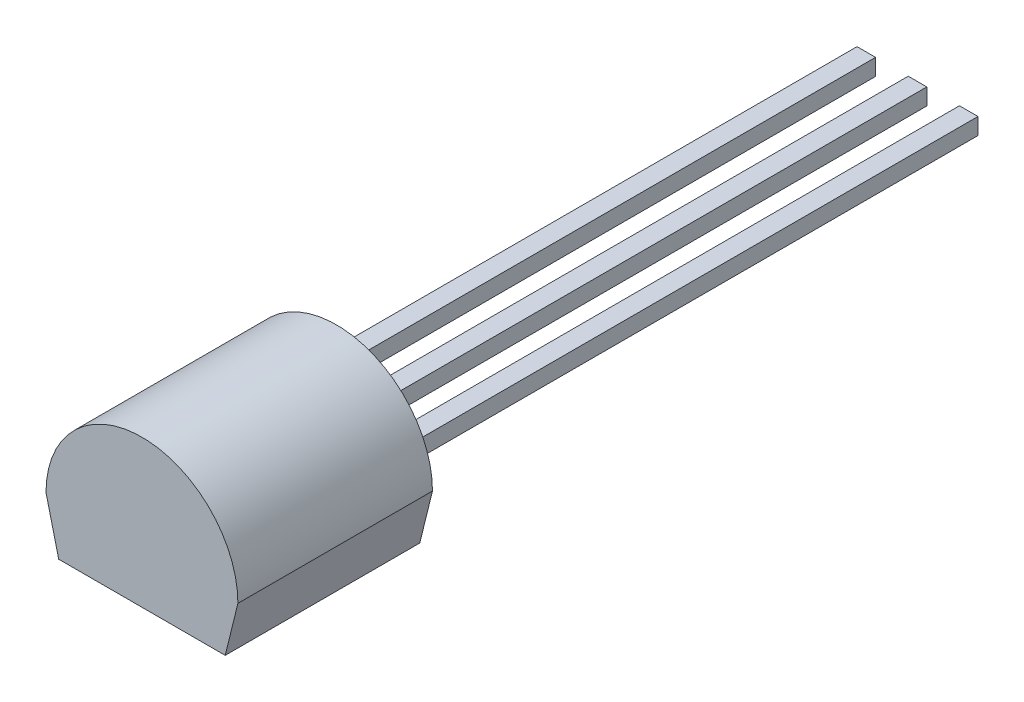
ISO-10303-21;
HEADER;
FILE_DESCRIPTION(('STEP AP214'),'2;1');
FILE_NAME('part.step','',(''),(''),'','','');
FILE_SCHEMA(('AUTOMOTIVE_DESIGN { 1 0 10303 214 1 1 1 1 }'));
ENDSEC;
DATA;
#1=APPLICATION_CONTEXT('core data for automotive mechanical design processes');
#2=APPLICATION_PROTOCOL_DEFINITION('international standard','automotive_design',2000,#1);
#3=PRODUCT_CONTEXT('',#1,'mechanical');
#4=PRODUCT('Part','Part','',(#3));
#5=PRODUCT_RELATED_PRODUCT_CATEGORY('part','',(#4));
#6=PRODUCT_DEFINITION_FORMATION('','',#4);
#7=PRODUCT_DEFINITION_CONTEXT('part definition',#1,'design');
#8=PRODUCT_DEFINITION('design','',#6,#7);
#9=PRODUCT_DEFINITION_SHAPE('','',#8);
#10=(LENGTH_UNIT() NAMED_UNIT(*) SI_UNIT(.MILLI.,.METRE.));
#11=(NAMED_UNIT(*) PLANE_ANGLE_UNIT() SI_UNIT($,.RADIAN.));
#12=(NAMED_UNIT(*) SI_UNIT($,.STERADIAN.) SOLID_ANGLE_UNIT());
#13=UNCERTAINTY_MEASURE_WITH_UNIT(LENGTH_MEASURE(1.E-05),#10,'distance_accuracy_value','');
#14=(GEOMETRIC_REPRESENTATION_CONTEXT(3) GLOBAL_UNCERTAINTY_ASSIGNED_CONTEXT((#13)) GLOBAL_UNIT_ASSIGNED_CONTEXT((#10,
#11,#12)) REPRESENTATION_CONTEXT('',''));
#15=CARTESIAN_POINT('',(0.,0.,0.));
#16=DIRECTION('',(0.,0.,1.));
#17=DIRECTION('',(1.,0.,0.));
#18=AXIS2_PLACEMENT_3D('',#15,#16,#17);
#19=CARTESIAN_POINT('',(-1.2698857,-0.20482562,0.));
#20=DIRECTION('',(0.,-1.,0.));
#21=DIRECTION('',(-1.,0.,0.));
#22=AXIS2_PLACEMENT_3D('',#19,#20,#21);
#23=PLANE('',#22);
#24=DIRECTION('',(1.,0.,0.));
#25=VECTOR('',#24,1.);
#26=CARTESIAN_POINT('',(-1.4998857,-0.20482562,-14.41));
#27=LINE('',#26,#25);
#28=CARTESIAN_POINT('',(-1.4998857,-0.20482562,-14.41));
#29=VERTEX_POINT('',#28);
#30=CARTESIAN_POINT('',(-1.0398857,-0.20482562,-14.41));
#31=VERTEX_POINT('',#30);
#32=EDGE_CURVE('E9',#29,#31,#27,.T.);
#33=ORIENTED_EDGE('',*,*,#32,.T.);
#34=DIRECTION('',(0.,0.,-1.));
#35=VECTOR('',#34,1.);
#36=CARTESIAN_POINT('',(-1.0398857,-0.20482562,0.));
#37=LINE('',#36,#35);
#38=CARTESIAN_POINT('',(-1.0398857,-0.20482562,0.));
#39=VERTEX_POINT('',#38);
#40=EDGE_CURVE('E22',#39,#31,#37,.T.);
#41=ORIENTED_EDGE('',*,*,#40,.F.);
#42=DIRECTION('',(1.,0.,0.));
#43=VECTOR('',#42,1.);
#44=CARTESIAN_POINT('',(-0.6348857,-0.20482562,0.));
#45=LINE('',#44,#43);
#46=CARTESIAN_POINT('',(-1.4998857,-0.20482562,0.));
#47=VERTEX_POINT('',#46);
#48=EDGE_CURVE('E255',#47,#39,#45,.T.);
#49=ORIENTED_EDGE('',*,*,#48,.F.);
#50=DIRECTION('',(0.,0.,-1.));
#51=VECTOR('',#50,1.);
#52=CARTESIAN_POINT('',(-1.4998857,-0.20482562,0.));
#53=LINE('',#52,#51);
#54=EDGE_CURVE('E253',#47,#29,#53,.T.);
#55=ORIENTED_EDGE('',*,*,#54,.T.);
#56=EDGE_LOOP('',(#33,#41,#49,#55));
#57=FACE_BOUND('',#56,.T.);
#58=ADVANCED_FACE('F15',(#57),#23,.T.);
#59=CARTESIAN_POINT('',(-1.0398857,0.000174380000000279,0.));
#60=DIRECTION('',(1.,0.,0.));
#61=DIRECTION('',(0.,0.,1.));
#62=AXIS2_PLACEMENT_3D('',#59,#60,#61);
#63=PLANE('',#62);
#64=DIRECTION('',(0.,1.,0.));
#65=VECTOR('',#64,1.);
#66=CARTESIAN_POINT('',(-1.0398857,-0.20482562,-14.41));
#67=LINE('',#66,#65);
#68=CARTESIAN_POINT('',(-1.0398857,0.20517438,-14.41));
#69=VERTEX_POINT('',#68);
#70=EDGE_CURVE('E251',#31,#69,#67,.T.);
#71=ORIENTED_EDGE('',*,*,#70,.T.);
#72=DIRECTION('',(0.,0.,-1.));
#73=VECTOR('',#72,1.);
#74=CARTESIAN_POINT('',(-1.0398857,0.20517438,0.));
#75=LINE('',#74,#73);
#76=CARTESIAN_POINT('',(-1.0398857,0.20517438,0.));
#77=VERTEX_POINT('',#76);
#78=EDGE_CURVE('E248',#77,#69,#75,.T.);
#79=ORIENTED_EDGE('',*,*,#78,.F.);
#80=DIRECTION('',(0.,1.,0.));
#81=VECTOR('',#80,1.);
#82=CARTESIAN_POINT('',(-1.0398857,0.0176768205073633,0.));
#83=LINE('',#82,#81);
#84=EDGE_CURVE('E245',#39,#77,#83,.T.);
#85=ORIENTED_EDGE('',*,*,#84,.F.);
#86=ORIENTED_EDGE('',*,*,#40,.T.);
#87=EDGE_LOOP('',(#71,#79,#85,#86));
#88=FACE_BOUND('',#87,.T.);
#89=ADVANCED_FACE('F259',(#88),#63,.T.);
#90=CARTESIAN_POINT('',(-1.2698857,0.20517438,0.));
#91=DIRECTION('',(0.,1.,0.));
#92=DIRECTION('',(0.,0.,1.));
#93=AXIS2_PLACEMENT_3D('',#90,#91,#92);
#94=PLANE('',#93);
#95=DIRECTION('',(-1.,0.,0.));
#96=VECTOR('',#95,1.);
#97=CARTESIAN_POINT('',(-1.0398857,0.20517438,-14.41));
#98=LINE('',#97,#96);
#99=CARTESIAN_POINT('',(-1.4998857,0.20517438,-14.41));
#100=VERTEX_POINT('',#99);
#101=EDGE_CURVE('E243',#69,#100,#98,.T.);
#102=ORIENTED_EDGE('',*,*,#101,.T.);
#103=DIRECTION('',(0.,0.,-1.));
#104=VECTOR('',#103,1.);
#105=CARTESIAN_POINT('',(-1.4998857,0.20517438,0.));
#106=LINE('',#105,#104);
#107=CARTESIAN_POINT('',(-1.4998857,0.20517438,0.));
#108=VERTEX_POINT('',#107);
#109=EDGE_CURVE('E240',#108,#100,#106,.T.);
#110=ORIENTED_EDGE('',*,*,#109,.F.);
#111=DIRECTION('',(-1.,0.,0.));
#112=VECTOR('',#111,1.);
#113=CARTESIAN_POINT('',(-0.6348857,0.20517438,0.));
#114=LINE('',#113,#112);
#115=EDGE_CURVE('E238',#77,#108,#114,.T.);
#116=ORIENTED_EDGE('',*,*,#115,.F.);
#117=ORIENTED_EDGE('',*,*,#78,.T.);
#118=EDGE_LOOP('',(#102,#110,#116,#117));
#119=FACE_BOUND('',#118,.T.);
#120=ADVANCED_FACE('F264',(#119),#94,.T.);
#121=CARTESIAN_POINT('',(-1.4998857,0.00017438000000039,0.));
#122=DIRECTION('',(-1.,0.,0.));
#123=DIRECTION('',(0.,0.,-1.));
#124=AXIS2_PLACEMENT_3D('',#121,#122,#123);
#125=PLANE('',#124);
#126=DIRECTION('',(0.,-1.,0.));
#127=VECTOR('',#126,1.);
#128=CARTESIAN_POINT('',(-1.4998857,0.20517438,-14.41));
#129=LINE('',#128,#127);
#130=EDGE_CURVE('E235',#100,#29,#129,.T.);
#131=ORIENTED_EDGE('',*,*,#130,.T.);
#132=ORIENTED_EDGE('',*,*,#54,.F.);
#133=DIRECTION('',(0.,-1.,0.));
#134=VECTOR('',#133,1.);
#135=CARTESIAN_POINT('',(-1.4998857,0.0176768205073634,0.));
#136=LINE('',#135,#134);
#137=EDGE_CURVE('E232',#108,#47,#136,.T.);
#138=ORIENTED_EDGE('',*,*,#137,.F.);
#139=ORIENTED_EDGE('',*,*,#109,.T.);
#140=EDGE_LOOP('',(#131,#132,#138,#139));
#141=FACE_BOUND('',#140,.T.);
#142=ADVANCED_FACE('F268',(#141),#125,.T.);
#143=CARTESIAN_POINT('',(-1.2698857,0.000174380000000335,-14.41));
#144=DIRECTION('',(0.,0.,1.));
#145=DIRECTION('',(1.,0.,0.));
#146=AXIS2_PLACEMENT_3D('',#143,#144,#145);
#147=PLANE('',#146);
#148=ORIENTED_EDGE('',*,*,#32,.F.);
#149=ORIENTED_EDGE('',*,*,#130,.F.);
#150=ORIENTED_EDGE('',*,*,#101,.F.);
#151=ORIENTED_EDGE('',*,*,#70,.F.);
#152=EDGE_LOOP('',(#148,#149,#150,#151));
#153=FACE_BOUND('',#152,.T.);
#154=ADVANCED_FACE('F261',(#153),#147,.F.);
#155=CARTESIAN_POINT('',(1.2701143,0.20517438,0.));
#156=DIRECTION('',(0.,1.,0.));
#157=DIRECTION('',(0.,0.,1.));
#158=AXIS2_PLACEMENT_3D('',#155,#156,#157);
#159=PLANE('',#158);
#160=DIRECTION('',(-1.,0.,0.));
#161=VECTOR('',#160,1.);
#162=CARTESIAN_POINT('',(1.0401143,0.20517438,-14.41));
#163=LINE('',#162,#161);
#164=CARTESIAN_POINT('',(1.5001143,0.20517438,-14.41));
#165=VERTEX_POINT('',#164);
#166=CARTESIAN_POINT('',(1.0401143,0.20517438,-14.41));
#167=VERTEX_POINT('',#166);
#168=EDGE_CURVE('E230',#165,#167,#163,.T.);
#169=ORIENTED_EDGE('',*,*,#168,.T.);
#170=DIRECTION('',(0.,0.,-1.));
#171=VECTOR('',#170,1.);
#172=CARTESIAN_POINT('',(1.0401143,0.20517438,0.));
#173=LINE('',#172,#171);
#174=CARTESIAN_POINT('',(1.0401143,0.20517438,0.));
#175=VERTEX_POINT('',#174);
#176=EDGE_CURVE('E227',#175,#167,#173,.T.);
#177=ORIENTED_EDGE('',*,*,#176,.F.);
#178=DIRECTION('',(-1.,0.,0.));
#179=VECTOR('',#178,1.);
#180=CARTESIAN_POINT('',(0.6351143,0.20517438,0.));
#181=LINE('',#180,#179);
#182=CARTESIAN_POINT('',(1.5001143,0.20517438,0.));
#183=VERTEX_POINT('',#182);
#184=EDGE_CURVE('E224',#183,#175,#181,.T.);
#185=ORIENTED_EDGE('',*,*,#184,.F.);
#186=DIRECTION('',(0.,0.,-1.));
#187=VECTOR('',#186,1.);
#188=CARTESIAN_POINT('',(1.5001143,0.20517438,0.));
#189=LINE('',#188,#187);
#190=EDGE_CURVE('E221',#183,#165,#189,.T.);
#191=ORIENTED_EDGE('',*,*,#190,.T.);
#192=EDGE_LOOP('',(#169,#177,#185,#191));
#193=FACE_BOUND('',#192,.T.);
#194=ADVANCED_FACE('F286',(#193),#159,.T.);
#195=CARTESIAN_POINT('',(1.0401143,0.00017437999999978,0.));
#196=DIRECTION('',(-1.,0.,0.));
#197=DIRECTION('',(0.,0.,-1.));
#198=AXIS2_PLACEMENT_3D('',#195,#196,#197);
#199=PLANE('',#198);
#200=DIRECTION('',(0.,-1.,0.));
#201=VECTOR('',#200,1.);
#202=CARTESIAN_POINT('',(1.0401143,-0.20482562,-14.41));
#203=LINE('',#202,#201);
#204=CARTESIAN_POINT('',(1.0401143,-0.20482562,-14.41));
#205=VERTEX_POINT('',#204);
#206=EDGE_CURVE('E219',#167,#205,#203,.T.);
#207=ORIENTED_EDGE('',*,*,#206,.T.);
#208=DIRECTION('',(0.,0.,-1.));
#209=VECTOR('',#208,1.);
#210=CARTESIAN_POINT('',(1.0401143,-0.20482562,0.));
#211=LINE('',#210,#209);
#212=CARTESIAN_POINT('',(1.0401143,-0.20482562,0.));
#213=VERTEX_POINT('',#212);
#214=EDGE_CURVE('E216',#213,#205,#211,.T.);
#215=ORIENTED_EDGE('',*,*,#214,.F.);
#216=DIRECTION('',(0.,-1.,0.));
#217=VECTOR('',#216,1.);
#218=CARTESIAN_POINT('',(1.0401143,0.0176768205073628,0.));
#219=LINE('',#218,#217);
#220=EDGE_CURVE('E213',#175,#213,#219,.T.);
#221=ORIENTED_EDGE('',*,*,#220,.F.);
#222=ORIENTED_EDGE('',*,*,#176,.T.);
#223=EDGE_LOOP('',(#207,#215,#221,#222));
#224=FACE_BOUND('',#223,.T.);
#225=ADVANCED_FACE('F289',(#224),#199,.T.);
#226=CARTESIAN_POINT('',(1.2701143,-0.20482562,0.));
#227=DIRECTION('',(0.,-1.,0.));
#228=DIRECTION('',(-1.,0.,0.));
#229=AXIS2_PLACEMENT_3D('',#226,#227,#228);
#230=PLANE('',#229);
#231=DIRECTION('',(1.,0.,0.));
#232=VECTOR('',#231,1.);
#233=CARTESIAN_POINT('',(1.5001143,-0.20482562,-14.41));
#234=LINE('',#233,#232);
#235=CARTESIAN_POINT('',(1.5001143,-0.20482562,-14.41));
#236=VERTEX_POINT('',#235);
#237=EDGE_CURVE('E211',#205,#236,#234,.T.);
#238=ORIENTED_EDGE('',*,*,#237,.T.);
#239=DIRECTION('',(0.,0.,-1.));
#240=VECTOR('',#239,1.);
#241=CARTESIAN_POINT('',(1.5001143,-0.20482562,0.));
#242=LINE('',#241,#240);
#243=CARTESIAN_POINT('',(1.5001143,-0.20482562,0.));
#244=VERTEX_POINT('',#243);
#245=EDGE_CURVE('E208',#244,#236,#242,.T.);
#246=ORIENTED_EDGE('',*,*,#245,.F.);
#247=DIRECTION('',(1.,0.,0.));
#248=VECTOR('',#247,1.);
#249=CARTESIAN_POINT('',(0.6351143,-0.20482562,0.));
#250=LINE('',#249,#248);
#251=EDGE_CURVE('E205',#213,#244,#250,.T.);
#252=ORIENTED_EDGE('',*,*,#251,.F.);
#253=ORIENTED_EDGE('',*,*,#214,.T.);
#254=EDGE_LOOP('',(#238,#246,#252,#253));
#255=FACE_BOUND('',#254,.T.);
#256=ADVANCED_FACE('F293',(#255),#230,.T.);
#257=CARTESIAN_POINT('',(1.5001143,0.000174379999999669,0.));
#258=DIRECTION('',(1.,0.,0.));
#259=DIRECTION('',(0.,0.,1.));
#260=AXIS2_PLACEMENT_3D('',#257,#258,#259);
#261=PLANE('',#260);
#262=DIRECTION('',(0.,1.,0.));
#263=VECTOR('',#262,1.);
#264=CARTESIAN_POINT('',(1.5001143,0.20517438,-14.41));
#265=LINE('',#264,#263);
#266=EDGE_CURVE('E202',#236,#165,#265,.T.);
#267=ORIENTED_EDGE('',*,*,#266,.T.);
#268=ORIENTED_EDGE('',*,*,#190,.F.);
#269=DIRECTION('',(0.,1.,0.));
#270=VECTOR('',#269,1.);
#271=CARTESIAN_POINT('',(1.5001143,0.0176768205073627,0.));
#272=LINE('',#271,#270);
#273=EDGE_CURVE('E199',#244,#183,#272,.T.);
#274=ORIENTED_EDGE('',*,*,#273,.F.);
#275=ORIENTED_EDGE('',*,*,#245,.T.);
#276=EDGE_LOOP('',(#267,#268,#274,#275));
#277=FACE_BOUND('',#276,.T.);
#278=ADVANCED_FACE('F297',(#277),#261,.T.);
#279=CARTESIAN_POINT('',(1.2701143,0.000174379999999724,-14.41));
#280=DIRECTION('',(0.,0.,1.));
#281=DIRECTION('',(1.,0.,0.));
#282=AXIS2_PLACEMENT_3D('',#279,#280,#281);
#283=PLANE('',#282);
#284=ORIENTED_EDGE('',*,*,#168,.F.);
#285=ORIENTED_EDGE('',*,*,#266,.F.);
#286=ORIENTED_EDGE('',*,*,#237,.F.);
#287=ORIENTED_EDGE('',*,*,#206,.F.);
#288=EDGE_LOOP('',(#284,#285,#286,#287));
#289=FACE_BOUND('',#288,.T.);
#290=ADVANCED_FACE('F301',(#289),#283,.F.);
#291=CARTESIAN_POINT('',(0.000114300000000098,0.20517438,0.));
#292=DIRECTION('',(0.,1.,0.));
#293=DIRECTION('',(0.,0.,1.));
#294=AXIS2_PLACEMENT_3D('',#291,#292,#293);
#295=PLANE('',#294);
#296=DIRECTION('',(-1.,0.,0.));
#297=VECTOR('',#296,1.);
#298=CARTESIAN_POINT('',(-0.2298857,0.20517438,-14.41));
#299=LINE('',#298,#297);
#300=CARTESIAN_POINT('',(0.2301143,0.20517438,-14.41));
#301=VERTEX_POINT('',#300);
#302=CARTESIAN_POINT('',(-0.2298857,0.20517438,-14.41));
#303=VERTEX_POINT('',#302);
#304=EDGE_CURVE('E197',#301,#303,#299,.T.);
#305=ORIENTED_EDGE('',*,*,#304,.T.);
#306=DIRECTION('',(0.,0.,-1.));
#307=VECTOR('',#306,1.);
#308=CARTESIAN_POINT('',(-0.2298857,0.20517438,0.));
#309=LINE('',#308,#307);
#310=CARTESIAN_POINT('',(-0.2298857,0.20517438,0.));
#311=VERTEX_POINT('',#310);
#312=EDGE_CURVE('E194',#311,#303,#309,.T.);
#313=ORIENTED_EDGE('',*,*,#312,.F.);
#314=DIRECTION('',(-1.,0.,0.));
#315=VECTOR('',#314,1.);
#316=CARTESIAN_POINT('',(0.000114300000000098,0.20517438,0.));
#317=LINE('',#316,#315);
#318=CARTESIAN_POINT('',(0.2301143,0.20517438,0.));
#319=VERTEX_POINT('',#318);
#320=EDGE_CURVE('E191',#319,#311,#317,.T.);
#321=ORIENTED_EDGE('',*,*,#320,.F.);
#322=DIRECTION('',(0.,0.,-1.));
#323=VECTOR('',#322,1.);
#324=CARTESIAN_POINT('',(0.2301143,0.20517438,0.));
#325=LINE('',#324,#323);
#326=EDGE_CURVE('E188',#319,#301,#325,.T.);
#327=ORIENTED_EDGE('',*,*,#326,.T.);
#328=EDGE_LOOP('',(#305,#313,#321,#327));
#329=FACE_BOUND('',#328,.T.);
#330=ADVANCED_FACE('F305',(#329),#295,.T.);
#331=CARTESIAN_POINT('',(-0.2298857,0.000174380000000085,0.));
#332=DIRECTION('',(-1.,0.,0.));
#333=DIRECTION('',(0.,-1.,0.));
#334=AXIS2_PLACEMENT_3D('',#331,#332,#333);
#335=PLANE('',#334);
#336=DIRECTION('',(0.,-1.,0.));
#337=VECTOR('',#336,1.);
#338=CARTESIAN_POINT('',(-0.2298857,-0.20482562,-14.41));
#339=LINE('',#338,#337);
#340=CARTESIAN_POINT('',(-0.2298857,-0.20482562,-14.41));
#341=VERTEX_POINT('',#340);
#342=EDGE_CURVE('E186',#303,#341,#339,.T.);
#343=ORIENTED_EDGE('',*,*,#342,.T.);
#344=DIRECTION('',(0.,0.,-1.));
#345=VECTOR('',#344,1.);
#346=CARTESIAN_POINT('',(-0.2298857,-0.20482562,0.));
#347=LINE('',#346,#345);
#348=CARTESIAN_POINT('',(-0.2298857,-0.20482562,0.));
#349=VERTEX_POINT('',#348);
#350=EDGE_CURVE('E183',#349,#341,#347,.T.);
#351=ORIENTED_EDGE('',*,*,#350,.F.);
#352=DIRECTION('',(0.,-1.,0.));
#353=VECTOR('',#352,1.);
#354=CARTESIAN_POINT('',(-0.2298857,0.0176768205073631,0.));
#355=LINE('',#354,#353);
#356=EDGE_CURVE('E180',#311,#349,#355,.T.);
#357=ORIENTED_EDGE('',*,*,#356,.F.);
#358=ORIENTED_EDGE('',*,*,#312,.T.);
#359=EDGE_LOOP('',(#343,#351,#357,#358));
#360=FACE_BOUND('',#359,.T.);
#361=ADVANCED_FACE('F309',(#360),#335,.T.);
#362=CARTESIAN_POINT('',(0.000114299999999963,-0.20482562,0.));
#363=DIRECTION('',(0.,-1.,0.));
#364=DIRECTION('',(-1.,0.,0.));
#365=AXIS2_PLACEMENT_3D('',#362,#363,#364);
#366=PLANE('',#365);
#367=DIRECTION('',(1.,0.,0.));
#368=VECTOR('',#367,1.);
#369=CARTESIAN_POINT('',(0.2301143,-0.20482562,-14.41));
#370=LINE('',#369,#368);
#371=CARTESIAN_POINT('',(0.2301143,-0.20482562,-14.41));
#372=VERTEX_POINT('',#371);
#373=EDGE_CURVE('E178',#341,#372,#370,.T.);
#374=ORIENTED_EDGE('',*,*,#373,.T.);
#375=DIRECTION('',(0.,0.,-1.));
#376=VECTOR('',#375,1.);
#377=CARTESIAN_POINT('',(0.2301143,-0.20482562,0.));
#378=LINE('',#377,#376);
#379=CARTESIAN_POINT('',(0.2301143,-0.20482562,0.));
#380=VERTEX_POINT('',#379);
#381=EDGE_CURVE('E175',#380,#372,#378,.T.);
#382=ORIENTED_EDGE('',*,*,#381,.F.);
#383=DIRECTION('',(1.,0.,0.));
#384=VECTOR('',#383,1.);
#385=CARTESIAN_POINT('',(0.000114299999999962,-0.20482562,0.));
#386=LINE('',#385,#384);
#387=EDGE_CURVE('E172',#349,#380,#386,.T.);
#388=ORIENTED_EDGE('',*,*,#387,.F.);
#389=ORIENTED_EDGE('',*,*,#350,.T.);
#390=EDGE_LOOP('',(#374,#382,#388,#389));
#391=FACE_BOUND('',#390,.T.);
#392=ADVANCED_FACE('F313',(#391),#366,.T.);
#393=CARTESIAN_POINT('',(0.2301143,0.000174379999999974,0.));
#394=DIRECTION('',(1.,0.,0.));
#395=DIRECTION('',(0.,1.,0.));
#396=AXIS2_PLACEMENT_3D('',#393,#394,#395);
#397=PLANE('',#396);
#398=DIRECTION('',(0.,1.,0.));
#399=VECTOR('',#398,1.);
#400=CARTESIAN_POINT('',(0.2301143,0.20517438,-14.41));
#401=LINE('',#400,#399);
#402=EDGE_CURVE('E169',#372,#301,#401,.T.);
#403=ORIENTED_EDGE('',*,*,#402,.T.);
#404=ORIENTED_EDGE('',*,*,#326,.F.);
#405=DIRECTION('',(0.,1.,0.));
#406=VECTOR('',#405,1.);
#407=CARTESIAN_POINT('',(0.2301143,0.017676820507363,0.));
#408=LINE('',#407,#406);
#409=EDGE_CURVE('E166',#380,#319,#408,.T.);
#410=ORIENTED_EDGE('',*,*,#409,.F.);
#411=ORIENTED_EDGE('',*,*,#381,.T.);
#412=EDGE_LOOP('',(#403,#404,#410,#411));
#413=FACE_BOUND('',#412,.T.);
#414=ADVANCED_FACE('F317',(#413),#397,.T.);
#415=CARTESIAN_POINT('',(0.000114300000000042,0.000174380000000029,-14.41));
#416=DIRECTION('',(0.,0.,1.));
#417=DIRECTION('',(1.,0.,0.));
#418=AXIS2_PLACEMENT_3D('',#415,#416,#417);
#419=PLANE('',#418);
#420=ORIENTED_EDGE('',*,*,#304,.F.);
#421=ORIENTED_EDGE('',*,*,#402,.F.);
#422=ORIENTED_EDGE('',*,*,#373,.F.);
#423=ORIENTED_EDGE('',*,*,#342,.F.);
#424=EDGE_LOOP('',(#420,#421,#422,#423));
#425=FACE_BOUND('',#424,.T.);
#426=ADVANCED_FACE('F321',(#425),#419,.F.);
#427=CARTESIAN_POINT('',(-2.2223857,-0.832325619999999,0.));
#428=DIRECTION('',(-0.970810619299264,-0.239847329473936,0.));
#429=DIRECTION('',(0.239847329473936,-0.970810619299264,0.));
#430=AXIS2_PLACEMENT_3D('',#427,#428,#429);
#431=PLANE('',#430);
#432=DIRECTION('',(-0.239847329473936,0.970810619299264,0.));
#433=VECTOR('',#432,1.);
#434=CARTESIAN_POINT('',(-2.0648857,-1.46982562,4.825));
#435=LINE('',#434,#433);
#436=CARTESIAN_POINT('',(-2.0648857,-1.46982562,4.825));
#437=VERTEX_POINT('',#436);
#438=CARTESIAN_POINT('',(-2.3798857,-0.194825619999999,4.825));
#439=VERTEX_POINT('',#438);
#440=EDGE_CURVE('E164',#437,#439,#435,.T.);
#441=ORIENTED_EDGE('',*,*,#440,.T.);
#442=DIRECTION('',(0.,0.,1.));
#443=VECTOR('',#442,1.);
#444=CARTESIAN_POINT('',(-2.3798857,-0.194825619999999,0.));
#445=LINE('',#444,#443);
#446=CARTESIAN_POINT('',(-2.3798857,-0.194825619999999,0.));
#447=VERTEX_POINT('',#446);
#448=EDGE_CURVE('E161',#447,#439,#445,.T.);
#449=ORIENTED_EDGE('',*,*,#448,.F.);
#450=DIRECTION('',(-0.239847329473936,0.970810619299264,0.));
#451=VECTOR('',#450,1.);
#452=CARTESIAN_POINT('',(-2.0648857,-1.46982562,0.));
#453=LINE('',#452,#451);
#454=CARTESIAN_POINT('',(-2.0648857,-1.46982562,0.));
#455=VERTEX_POINT('',#454);
#456=EDGE_CURVE('E159',#455,#447,#453,.T.);
#457=ORIENTED_EDGE('',*,*,#456,.F.);
#458=DIRECTION('',(0.,0.,1.));
#459=VECTOR('',#458,1.);
#460=CARTESIAN_POINT('',(-2.0648857,-1.46982562,0.));
#461=LINE('',#460,#459);
#462=EDGE_CURVE('E147',#455,#437,#461,.T.);
#463=ORIENTED_EDGE('',*,*,#462,.T.);
#464=EDGE_LOOP('',(#441,#449,#457,#463));
#465=FACE_BOUND('',#464,.T.);
#466=ADVANCED_FACE('F325',(#465),#431,.T.);
#467=CARTESIAN_POINT('',(0.0001143,-0.19482562,0.));
#468=DIRECTION('',(0.,0.,1.));
#469=DIRECTION('',(1.,0.,0.));
#470=AXIS2_PLACEMENT_3D('',#467,#468,#469);
#471=CYLINDRICAL_SURFACE('',#470,2.38);
#472=CARTESIAN_POINT('',(0.0001143,-0.19482562,4.825));
#473=DIRECTION('',(0.,0.,-1.));
#474=DIRECTION('',(1.,0.,0.));
#475=AXIS2_PLACEMENT_3D('',#472,#473,#474);
#476=CIRCLE('',#475,2.38);
#477=CARTESIAN_POINT('',(2.3801143,-0.194825620000001,4.825));
#478=VERTEX_POINT('',#477);
#479=EDGE_CURVE('E155',#439,#478,#476,.T.);
#480=ORIENTED_EDGE('',*,*,#479,.T.);
#481=DIRECTION('',(0.,0.,1.));
#482=VECTOR('',#481,1.);
#483=CARTESIAN_POINT('',(2.3801143,-0.194825620000001,0.));
#484=LINE('',#483,#482);
#485=CARTESIAN_POINT('',(2.3801143,-0.194825620000001,0.));
#486=VERTEX_POINT('',#485);
#487=EDGE_CURVE('E153',#486,#478,#484,.T.);
#488=ORIENTED_EDGE('',*,*,#487,.F.);
#489=CARTESIAN_POINT('',(0.0001143,-0.19482562,0.));
#490=DIRECTION('',(0.,0.,1.));
#491=DIRECTION('',(1.,0.,0.));
#492=AXIS2_PLACEMENT_3D('',#489,#490,#491);
#493=CIRCLE('',#492,2.38);
#494=EDGE_CURVE('E141',#486,#447,#493,.T.);
#495=ORIENTED_EDGE('',*,*,#494,.T.);
#496=ORIENTED_EDGE('',*,*,#448,.T.);
#497=EDGE_LOOP('',(#480,#488,#495,#496));
#498=FACE_BOUND('',#497,.T.);
#499=ADVANCED_FACE('F329',(#498),#471,.T.);
#500=CARTESIAN_POINT('',(2.2226143,-0.83232562,0.));
#501=DIRECTION('',(0.970810619299264,-0.239847329473936,0.));
#502=DIRECTION('',(0.239847329473936,0.970810619299264,0.));
#503=AXIS2_PLACEMENT_3D('',#500,#501,#502);
#504=PLANE('',#503);
#505=DIRECTION('',(-0.239847329473936,-0.970810619299264,0.));
#506=VECTOR('',#505,1.);
#507=CARTESIAN_POINT('',(2.3801143,-0.194825620000001,4.825));
#508=LINE('',#507,#506);
#509=CARTESIAN_POINT('',(2.0651143,-1.46982562,4.825));
#510=VERTEX_POINT('',#509);
#511=EDGE_CURVE('E130',#478,#510,#508,.T.);
#512=ORIENTED_EDGE('',*,*,#511,.T.);
#513=DIRECTION('',(0.,0.,1.));
#514=VECTOR('',#513,1.);
#515=CARTESIAN_POINT('',(2.0651143,-1.46982562,0.));
#516=LINE('',#515,#514);
#517=CARTESIAN_POINT('',(2.0651143,-1.46982562,0.));
#518=VERTEX_POINT('',#517);
#519=EDGE_CURVE('E124',#518,#510,#516,.T.);
#520=ORIENTED_EDGE('',*,*,#519,.F.);
#521=DIRECTION('',(-0.239847329473936,-0.970810619299264,0.));
#522=VECTOR('',#521,1.);
#523=CARTESIAN_POINT('',(2.3801143,-0.194825620000001,0.));
#524=LINE('',#523,#522);
#525=EDGE_CURVE('E128',#486,#518,#524,.T.);
#526=ORIENTED_EDGE('',*,*,#525,.F.);
#527=ORIENTED_EDGE('',*,*,#487,.T.);
#528=EDGE_LOOP('',(#512,#520,#526,#527));
#529=FACE_BOUND('',#528,.T.);
#530=ADVANCED_FACE('F126',(#529),#504,.T.);
#531=CARTESIAN_POINT('',(0.000114299999999688,-1.46982562,0.));
#532=DIRECTION('',(0.,-1.,0.));
#533=DIRECTION('',(0.,0.,-1.));
#534=AXIS2_PLACEMENT_3D('',#531,#532,#533);
#535=PLANE('',#534);
#536=DIRECTION('',(-1.,0.,0.));
#537=VECTOR('',#536,1.);
#538=CARTESIAN_POINT('',(2.0651143,-1.46982562,4.825));
#539=LINE('',#538,#537);
#540=EDGE_CURVE('E142',#510,#437,#539,.T.);
#541=ORIENTED_EDGE('',*,*,#540,.T.);
#542=ORIENTED_EDGE('',*,*,#462,.F.);
#543=DIRECTION('',(-1.,0.,0.));
#544=VECTOR('',#543,1.);
#545=CARTESIAN_POINT('',(2.0651143,-1.46982562,0.));
#546=LINE('',#545,#544);
#547=EDGE_CURVE('E140',#518,#455,#546,.T.);
#548=ORIENTED_EDGE('',*,*,#547,.F.);
#549=ORIENTED_EDGE('',*,*,#519,.T.);
#550=EDGE_LOOP('',(#541,#542,#548,#549));
#551=FACE_BOUND('',#550,.T.);
#552=ADVANCED_FACE('F145',(#551),#535,.T.);
#553=CARTESIAN_POINT('',(0.000114300000000056,0.035179261014726,4.825));
#554=DIRECTION('',(0.,0.,1.));
#555=DIRECTION('',(1.,0.,0.));
#556=AXIS2_PLACEMENT_3D('',#553,#554,#555);
#557=PLANE('',#556);
#558=ORIENTED_EDGE('',*,*,#440,.F.);
#559=ORIENTED_EDGE('',*,*,#540,.F.);
#560=ORIENTED_EDGE('',*,*,#511,.F.);
#561=ORIENTED_EDGE('',*,*,#479,.F.);
#562=EDGE_LOOP('',(#558,#559,#560,#561));
#563=FACE_BOUND('',#562,.T.);
#564=ADVANCED_FACE('F338',(#563),#557,.T.);
#565=CARTESIAN_POINT('',(0.000114300000000056,0.035179261014726,0.));
#566=DIRECTION('',(0.,0.,1.));
#567=DIRECTION('',(1.,0.,0.));
#568=AXIS2_PLACEMENT_3D('',#565,#566,#567);
#569=PLANE('',#568);
#570=ORIENTED_EDGE('',*,*,#48,.T.);
#571=ORIENTED_EDGE('',*,*,#84,.T.);
#572=ORIENTED_EDGE('',*,*,#115,.T.);
#573=ORIENTED_EDGE('',*,*,#137,.T.);
#574=EDGE_LOOP('',(#570,#571,#572,#573));
#575=FACE_BOUND('',#574,.T.);
#576=ORIENTED_EDGE('',*,*,#184,.T.);
#577=ORIENTED_EDGE('',*,*,#220,.T.);
#578=ORIENTED_EDGE('',*,*,#251,.T.);
#579=ORIENTED_EDGE('',*,*,#273,.T.);
#580=EDGE_LOOP('',(#576,#577,#578,#579));
#581=FACE_BOUND('',#580,.T.);
#582=ORIENTED_EDGE('',*,*,#320,.T.);
#583=ORIENTED_EDGE('',*,*,#356,.T.);
#584=ORIENTED_EDGE('',*,*,#387,.T.);
#585=ORIENTED_EDGE('',*,*,#409,.T.);
#586=EDGE_LOOP('',(#582,#583,#584,#585));
#587=FACE_BOUND('',#586,.T.);
#588=ORIENTED_EDGE('',*,*,#547,.T.);
#589=ORIENTED_EDGE('',*,*,#456,.T.);
#590=ORIENTED_EDGE('',*,*,#494,.F.);
#591=ORIENTED_EDGE('',*,*,#525,.T.);
#592=EDGE_LOOP('',(#588,#589,#590,#591));
#593=FACE_BOUND('',#592,.T.);
#594=ADVANCED_FACE('F138',(#575,#581,#587,#593),#569,.F.);
#595=CLOSED_SHELL('',(#58,#89,#120,#142,#154,#194,#225,#256,#278,#290,#330,#361,#392,#414,#426,
#466,#499,#530,#552,#564,#594));
#596=MANIFOLD_SOLID_BREP('B1',#595);
#597=ADVANCED_BREP_SHAPE_REPRESENTATION('',(#18,#596),#14);
#598=SHAPE_DEFINITION_REPRESENTATION(#9,#597);
ENDSEC;
END-ISO-10303-21;
